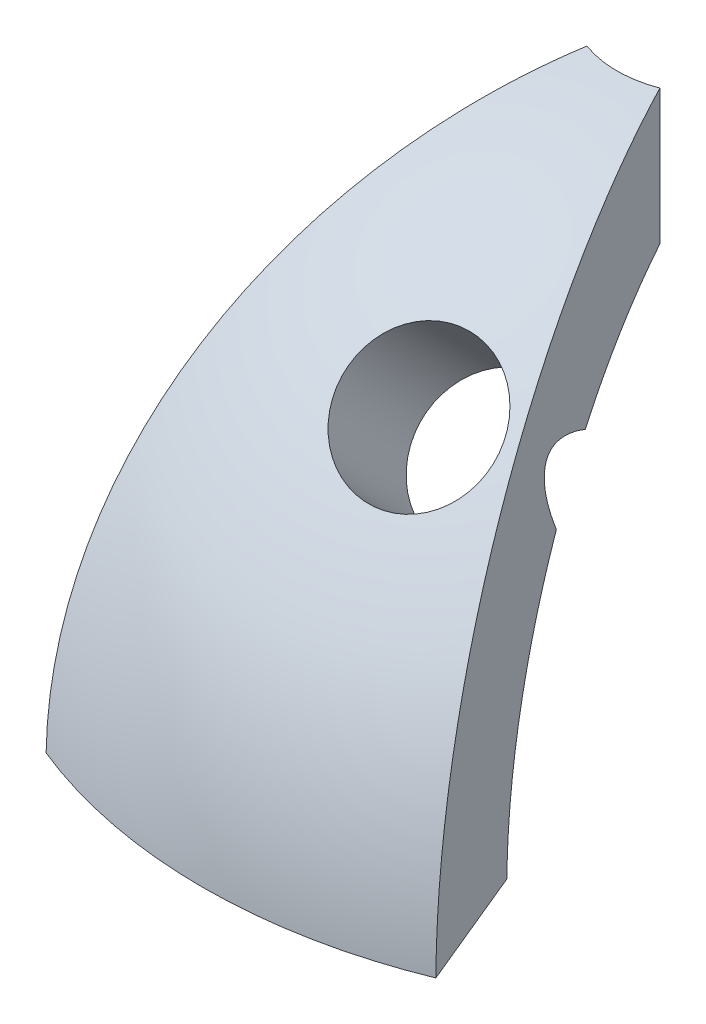
ISO-10303-21;
HEADER;
FILE_DESCRIPTION(('STEP AP214'),'2;1');
FILE_NAME('part.step','',(''),(''),'','','');
FILE_SCHEMA(('AUTOMOTIVE_DESIGN { 1 0 10303 214 1 1 1 1 }'));
ENDSEC;
DATA;
#1=APPLICATION_CONTEXT('core data for automotive mechanical design processes');
#2=APPLICATION_PROTOCOL_DEFINITION('international standard','automotive_design',2000,#1);
#3=PRODUCT_CONTEXT('',#1,'mechanical');
#4=PRODUCT('Part','Part','',(#3));
#5=PRODUCT_RELATED_PRODUCT_CATEGORY('part','',(#4));
#6=PRODUCT_DEFINITION_FORMATION('','',#4);
#7=PRODUCT_DEFINITION_CONTEXT('part definition',#1,'design');
#8=PRODUCT_DEFINITION('design','',#6,#7);
#9=PRODUCT_DEFINITION_SHAPE('','',#8);
#10=(LENGTH_UNIT() NAMED_UNIT(*) SI_UNIT(.MILLI.,.METRE.));
#11=(NAMED_UNIT(*) PLANE_ANGLE_UNIT() SI_UNIT($,.RADIAN.));
#12=(NAMED_UNIT(*) SI_UNIT($,.STERADIAN.) SOLID_ANGLE_UNIT());
#13=UNCERTAINTY_MEASURE_WITH_UNIT(LENGTH_MEASURE(1.E-05),#10,'distance_accuracy_value','');
#14=(GEOMETRIC_REPRESENTATION_CONTEXT(3) GLOBAL_UNCERTAINTY_ASSIGNED_CONTEXT((#13)) GLOBAL_UNIT_ASSIGNED_CONTEXT((#10,
#11,#12)) REPRESENTATION_CONTEXT('',''));
#15=CARTESIAN_POINT('',(0.,0.,0.));
#16=DIRECTION('',(0.,0.,1.));
#17=DIRECTION('',(1.,0.,0.));
#18=AXIS2_PLACEMENT_3D('',#15,#16,#17);
#19=CARTESIAN_POINT('',(0.,0.,0.));
#20=DIRECTION('',(0.,-1.,0.));
#21=DIRECTION('',(0.382683432365091,0.,0.923879532511287));
#22=AXIS2_PLACEMENT_3D('',#19,#20,#21);
#23=SPHERICAL_SURFACE('',#22,14.22);
#24=CARTESIAN_POINT('',(1.53865384615384,2.60126354312483,13.895120450033));
#25=CARTESIAN_POINT('',(1.43295666846133,2.7603553492787,13.8770437774443));
#26=CARTESIAN_POINT('',(1.32674036358629,2.91867206849215,13.8551917159716));
#27=CARTESIAN_POINT('',(1.11791548394628,3.22695924291126,13.8050421724665));
#28=CARTESIAN_POINT('',(1.0153409415016,3.37700264889497,13.7770511101305));
#29=CARTESIAN_POINT('',(0.814081481677308,3.66874815942652,13.7155710425161));
#30=CARTESIAN_POINT('',(0.715421543614758,3.81052911480833,13.6823742919679));
#31=CARTESIAN_POINT('',(0.522178746878185,4.0857824659932,13.6114028905999));
#32=CARTESIAN_POINT('',(0.427614532707512,4.21933947211681,13.5739051060821));
#33=CARTESIAN_POINT('',(0.226070652323176,4.5014823404095,13.4881351470725));
#34=CARTESIAN_POINT('',(0.119049274629687,4.64980674314402,13.4390984022335));
#35=CARTESIAN_POINT('',(-0.091588324743938,4.93890168078947,13.3356948987623));
#36=CARTESIAN_POINT('',(-0.195199182859857,5.07975923385487,13.281560191336));
#37=CARTESIAN_POINT('',(-0.398834780521729,5.35398172767666,13.1687292829852));
#38=CARTESIAN_POINT('',(-0.498859980621159,5.4874375467552,13.1102547423254));
#39=CARTESIAN_POINT('',(-0.695210440686985,5.74694021866717,12.9894883772696));
#40=CARTESIAN_POINT('',(-0.791540405244985,5.8730815436922,12.9274071277705));
#41=CARTESIAN_POINT('',(-0.88775340544872,5.99788098582003,12.8625704107326));
#42=B_SPLINE_CURVE_WITH_KNOTS('',3,(#24,#25,#26,#27,#28,#29,#30,#31,#32,#33,#34,#35,#36,#37,#38,
#39,#40,#41),.UNSPECIFIED.,.F.,.F.,(4,2,2,2,2,2,2,2,4),(0.,0.575527356792285,1.12707977508195,
1.65463075584792,2.15818884095048,2.72612225201319,3.2751312331309,3.80520900671717,
4.31637808545506),.UNSPECIFIED.);
#43=CARTESIAN_POINT('',(1.53865384615384,2.60126354312483,13.895120450033));
#44=VERTEX_POINT('',#43);
#45=CARTESIAN_POINT('',(-0.887753405448717,5.99788098582003,12.8625704107326));
#46=VERTEX_POINT('',#45);
#47=EDGE_CURVE('E239',#44,#46,#42,.T.);
#48=ORIENTED_EDGE('',*,*,#47,.T.);
#49=CARTESIAN_POINT('',(0.,0.571906271362396,-0.236891334004535));
#50=DIRECTION('',(0.,-0.923879532511287,0.38268343236509));
#51=DIRECTION('',(0.,-0.38268343236509,-0.923879532511287));
#52=AXIS2_PLACEMENT_3D('',#49,#50,#51);
#53=CIRCLE('',#52,14.2065198311427);
#54=CARTESIAN_POINT('',(-0.968782051282049,5.99585052480526,12.8576684442128));
#55=VERTEX_POINT('',#54);
#56=EDGE_CURVE('E241',#46,#55,#53,.T.);
#57=ORIENTED_EDGE('',*,*,#56,.T.);
#58=CARTESIAN_POINT('',(-0.968782051282052,0.,0.));
#59=DIRECTION('',(1.,0.,0.));
#60=DIRECTION('',(0.,0.,-1.));
#61=AXIS2_PLACEMENT_3D('',#58,#59,#60);
#62=CIRCLE('',#61,14.186960961993);
#63=CARTESIAN_POINT('',(-0.968782051282052,3.07583362103488,13.8495165573685));
#64=VERTEX_POINT('',#63);
#65=EDGE_CURVE('E303',#55,#64,#62,.T.);
#66=ORIENTED_EDGE('',*,*,#65,.T.);
#67=CARTESIAN_POINT('',(0.,-2.27115532080022,0.940743336131267));
#68=DIRECTION('',(0.,-0.923879532511287,0.38268343236509));
#69=DIRECTION('',(0.,-0.38268343236509,-0.923879532511287));
#70=AXIS2_PLACEMENT_3D('',#67,#68,#69);
#71=CIRCLE('',#70,14.0059007380577);
#72=CARTESIAN_POINT('',(-1.48166666666666,3.05859486275467,13.80789851333));
#73=VERTEX_POINT('',#72);
#74=EDGE_CURVE('E319',#64,#73,#71,.T.);
#75=ORIENTED_EDGE('',*,*,#74,.T.);
#76=CARTESIAN_POINT('',(-1.48166666666667,0.,0.));
#77=DIRECTION('',(1.,0.,0.));
#78=DIRECTION('',(0.,0.,-1.));
#79=AXIS2_PLACEMENT_3D('',#76,#77,#78);
#80=CIRCLE('',#79,14.1425974944099);
#81=CARTESIAN_POINT('',(-1.48166666666667,2.6036438321158,13.9008669759974));
#82=VERTEX_POINT('',#81);
#83=EDGE_CURVE('E551',#73,#82,#80,.T.);
#84=ORIENTED_EDGE('',*,*,#83,.T.);
#85=CARTESIAN_POINT('',(0.,-2.69234963075024,1.11520773170694));
#86=DIRECTION('',(0.,0.923879532511287,-0.38268343236509));
#87=DIRECTION('',(0.,0.38268343236509,0.923879532511287));
#88=AXIS2_PLACEMENT_3D('',#85,#86,#87);
#89=CIRCLE('',#88,13.9181882865889);
#90=CARTESIAN_POINT('',(-0.968782051282055,2.62099211279716,13.9427494305022));
#91=VERTEX_POINT('',#90);
#92=EDGE_CURVE('E556',#82,#91,#89,.T.);
#93=ORIENTED_EDGE('',*,*,#92,.T.);
#94=CARTESIAN_POINT('',(-0.968782051282052,0.,0.));
#95=DIRECTION('',(1.,0.,0.));
#96=DIRECTION('',(0.,0.,-1.));
#97=AXIS2_PLACEMENT_3D('',#94,#95,#96);
#98=CIRCLE('',#97,14.186960961993);
#99=CARTESIAN_POINT('',(-0.968782051282053,1.57551403444439,14.0992062494448));
#100=VERTEX_POINT('',#99);
#101=EDGE_CURVE('E561',#91,#100,#98,.T.);
#102=ORIENTED_EDGE('',*,*,#101,.T.);
#103=CARTESIAN_POINT('',(0.,-3.64003682813778,1.50775262175221));
#104=DIRECTION('',(0.,0.923879532511287,-0.38268343236509));
#105=DIRECTION('',(0.,0.38268343236509,0.923879532511287));
#106=AXIS2_PLACEMENT_3D('',#103,#104,#105);
#107=CIRCLE('',#106,13.6632797644416);
#108=CARTESIAN_POINT('',(-0.5698717948718,1.58412410957177,14.1199928095904));
#109=VERTEX_POINT('',#108);
#110=EDGE_CURVE('E566',#100,#109,#107,.T.);
#111=ORIENTED_EDGE('',*,*,#110,.T.);
#112=CARTESIAN_POINT('',(-0.569871794871796,0.,0.));
#113=DIRECTION('',(-1.,0.,0.));
#114=DIRECTION('',(0.,0.,1.));
#115=AXIS2_PLACEMENT_3D('',#112,#113,#114);
#116=CIRCLE('',#115,14.2085764993334);
#117=CARTESIAN_POINT('',(-0.569871794871799,2.62944397541602,13.9631540318639));
#118=VERTEX_POINT('',#117);
#119=EDGE_CURVE('E571',#109,#118,#116,.T.);
#120=ORIENTED_EDGE('',*,*,#119,.T.);
#121=CARTESIAN_POINT('',(0.,-2.69234963075024,1.11520773170694));
#122=DIRECTION('',(0.,0.923879532511287,-0.38268343236509));
#123=DIRECTION('',(0.,0.38268343236509,0.923879532511287));
#124=AXIS2_PLACEMENT_3D('',#121,#122,#123);
#125=CIRCLE('',#124,13.9181882865889);
#126=EDGE_CURVE('E243',#118,#44,#125,.T.);
#127=ORIENTED_EDGE('',*,*,#126,.T.);
#128=EDGE_LOOP('',(#48,#57,#66,#75,#84,#93,#102,#111,#120,#127));
#129=FACE_BOUND('',#128,.T.);
#130=CARTESIAN_POINT('',(-0.115484941563909,0.,0.0478354290456357));
#131=DIRECTION('',(0.923879532511287,0.,-0.382683432365091));
#132=DIRECTION('',(-0.38268343236509,0.,-0.923879532511286));
#133=AXIS2_PLACEMENT_3D('',#130,#131,#132);
#134=CIRCLE('',#133,14.2194505871359);
#135=CARTESIAN_POINT('',(3.2840355653589,11.1030815684665,8.25500394242411));
#136=VERTEX_POINT('',#135);
#137=CARTESIAN_POINT('',(1.34175402255179,13.7000839413487,3.56592149983228));
#138=VERTEX_POINT('',#137);
#139=EDGE_CURVE('E164',#136,#138,#134,.F.);
#140=ORIENTED_EDGE('',*,*,#139,.F.);
#141=CARTESIAN_POINT('',(1.54636947473554,9.88509453040284,9.76339261335967));
#142=DIRECTION('',(-0.110615871041227,-0.707106781186547,-0.698401123333712));
#143=DIRECTION('',(0.,0.70271351130156,-0.711472923612861));
#144=AXIS2_PLACEMENT_3D('',#141,#142,#143);
#145=CIRCLE('',#144,2.6035);
#146=CARTESIAN_POINT('',(4.03658696996794,9.19090485134972,10.0718237498142));
#147=VERTEX_POINT('',#146);
#148=EDGE_CURVE('E45',#136,#147,#145,.F.);
#149=ORIENTED_EDGE('',*,*,#148,.T.);
#150=CARTESIAN_POINT('',(5.32522212941495,0.249999999999996,13.182864228702));
#151=VERTEX_POINT('',#150);
#152=EDGE_CURVE('E161',#151,#147,#134,.F.);
#153=ORIENTED_EDGE('',*,*,#152,.F.);
#154=CARTESIAN_POINT('',(0.,0.249999999999996,0.));
#155=DIRECTION('',(0.,-1.,0.));
#156=DIRECTION('',(0.,0.,-1.));
#157=AXIS2_PLACEMENT_3D('',#154,#155,#156);
#158=CIRCLE('',#157,14.2178022211592);
#159=CARTESIAN_POINT('',(-5.32522212941495,0.249999999999996,13.182864228702));
#160=VERTEX_POINT('',#159);
#161=EDGE_CURVE('E169',#151,#160,#158,.T.);
#162=ORIENTED_EDGE('',*,*,#161,.T.);
#163=CARTESIAN_POINT('',(0.115484941563912,0.,0.0478354290456367));
#164=DIRECTION('',(-0.923879532511286,0.,-0.382683432365091));
#165=DIRECTION('',(-0.382683432365091,0.,0.923879532511286));
#166=AXIS2_PLACEMENT_3D('',#163,#164,#165);
#167=CIRCLE('',#166,14.2194505871359);
#168=CARTESIAN_POINT('',(-1.34175402255179,13.7000839413487,3.56592149983228));
#169=VERTEX_POINT('',#168);
#170=EDGE_CURVE('E355',#169,#160,#167,.F.);
#171=ORIENTED_EDGE('',*,*,#170,.F.);
#172=CARTESIAN_POINT('',(0.,13.7000839413487,0.));
#173=DIRECTION('',(0.,-1.,0.));
#174=DIRECTION('',(0.,0.,-1.));
#175=AXIS2_PLACEMENT_3D('',#172,#173,#174);
#176=CIRCLE('',#175,3.81);
#177=EDGE_CURVE('E182',#138,#169,#176,.T.);
#178=ORIENTED_EDGE('',*,*,#177,.F.);
#179=EDGE_LOOP('',(#140,#149,#153,#162,#171,#178));
#180=FACE_BOUND('',#179,.T.);
#181=ADVANCED_FACE('F32',(#129,#180),#23,.F.);
#182=CARTESIAN_POINT('',(0.,0.,0.));
#183=DIRECTION('',(0.,-1.,0.));
#184=DIRECTION('',(0.,0.,-1.));
#185=AXIS2_PLACEMENT_3D('',#182,#183,#184);
#186=CYLINDRICAL_SURFACE('',#185,3.81);
#187=DIRECTION('',(0.,-1.,0.));
#188=VECTOR('',#187,1.);
#189=CARTESIAN_POINT('',(1.34175402255179,0.249999999999994,3.56592149983228));
#190=LINE('',#189,#188);
#191=CARTESIAN_POINT('',(1.34175402255179,18.6651118400078,3.56592149983228));
#192=VERTEX_POINT('',#191);
#193=EDGE_CURVE('E332',#192,#138,#190,.T.);
#194=ORIENTED_EDGE('',*,*,#193,.T.);
#195=ORIENTED_EDGE('',*,*,#177,.T.);
#196=DIRECTION('',(0.,-1.,0.));
#197=VECTOR('',#196,1.);
#198=CARTESIAN_POINT('',(-1.34175402255179,0.249999999999994,3.56592149983228));
#199=LINE('',#198,#197);
#200=CARTESIAN_POINT('',(-1.34175402255179,18.6651118400078,3.56592149983228));
#201=VERTEX_POINT('',#200);
#202=EDGE_CURVE('E310',#201,#169,#199,.T.);
#203=ORIENTED_EDGE('',*,*,#202,.F.);
#204=CARTESIAN_POINT('',(0.,18.6651118400078,0.));
#205=DIRECTION('',(0.,-1.,0.));
#206=DIRECTION('',(0.,0.,-1.));
#207=AXIS2_PLACEMENT_3D('',#204,#205,#206);
#208=CIRCLE('',#207,3.81);
#209=EDGE_CURVE('E179',#192,#201,#208,.T.);
#210=ORIENTED_EDGE('',*,*,#209,.F.);
#211=EDGE_LOOP('',(#194,#195,#203,#210));
#212=FACE_BOUND('',#211,.T.);
#213=ADVANCED_FACE('F34',(#212),#186,.F.);
#214=CARTESIAN_POINT('',(0.,0.,0.));
#215=DIRECTION('',(0.,-1.,0.));
#216=DIRECTION('',(0.382683432365091,0.,0.923879532511287));
#217=AXIS2_PLACEMENT_3D('',#214,#215,#216);
#218=SPHERICAL_SURFACE('',#217,19.05);
#219=CARTESIAN_POINT('',(2.08746037533585,13.3439928010697,13.179706106602));
#220=DIRECTION('',(-0.110615871041227,-0.707106781186547,-0.698401123333712));
#221=DIRECTION('',(0.,0.70271351130156,-0.711472923612861));
#222=AXIS2_PLACEMENT_3D('',#219,#220,#221);
#223=CIRCLE('',#222,2.6035);
#224=CARTESIAN_POINT('',(2.08746037533585,15.1735074277433,11.3273863499759));
#225=VERTEX_POINT('',#224);
#226=EDGE_CURVE('E165',#225,#225,#223,.T.);
#227=ORIENTED_EDGE('',*,*,#226,.T.);
#228=EDGE_LOOP('',(#227));
#229=FACE_BOUND('',#228,.T.);
#230=CARTESIAN_POINT('',(-0.115484941563909,0.,0.0478354290456357));
#231=DIRECTION('',(0.923879532511287,0.,-0.382683432365091));
#232=DIRECTION('',(-0.38268343236509,0.,-0.923879532511286));
#233=AXIS2_PLACEMENT_3D('',#230,#231,#232);
#234=CIRCLE('',#233,19.0495898905987);
#235=CARTESIAN_POINT('',(7.17384970083417,0.249999999999994,17.6458459833991));
#236=VERTEX_POINT('',#235);
#237=EDGE_CURVE('E173',#192,#236,#234,.T.);
#238=ORIENTED_EDGE('',*,*,#237,.F.);
#239=ORIENTED_EDGE('',*,*,#209,.T.);
#240=CARTESIAN_POINT('',(0.115484941563912,0.,0.0478354290456367));
#241=DIRECTION('',(-0.923879532511286,0.,-0.382683432365091));
#242=DIRECTION('',(-0.382683432365091,0.,0.923879532511286));
#243=AXIS2_PLACEMENT_3D('',#240,#241,#242);
#244=CIRCLE('',#243,19.0495898905987);
#245=CARTESIAN_POINT('',(-7.17384970083417,0.249999999999995,17.6458459833991));
#246=VERTEX_POINT('',#245);
#247=EDGE_CURVE('E359',#246,#201,#244,.T.);
#248=ORIENTED_EDGE('',*,*,#247,.F.);
#249=CARTESIAN_POINT('',(0.,0.249999999999994,0.));
#250=DIRECTION('',(0.,-1.,0.));
#251=DIRECTION('',(0.,0.,-1.));
#252=AXIS2_PLACEMENT_3D('',#249,#250,#251);
#253=CIRCLE('',#252,19.0483595094171);
#254=EDGE_CURVE('E171',#236,#246,#253,.T.);
#255=ORIENTED_EDGE('',*,*,#254,.F.);
#256=EDGE_LOOP('',(#238,#239,#248,#255));
#257=FACE_BOUND('',#256,.T.);
#258=ADVANCED_FACE('F223',(#229,#257),#218,.T.);
#259=CARTESIAN_POINT('',(5.44091735468122,0.249999999999995,13.1355364694225));
#260=DIRECTION('',(0.,1.,0.));
#261=DIRECTION('',(0.,0.,1.));
#262=AXIS2_PLACEMENT_3D('',#259,#260,#261);
#263=PLANE('',#262);
#264=DIRECTION('',(-0.38268343236509,0.,-0.923879532511286));
#265=VECTOR('',#264,1.);
#266=CARTESIAN_POINT('',(5.32543241311731,0.249999999999995,13.1833718984682));
#267=LINE('',#266,#265);
#268=EDGE_CURVE('E40',#236,#151,#267,.T.);
#269=ORIENTED_EDGE('',*,*,#268,.F.);
#270=ORIENTED_EDGE('',*,*,#254,.T.);
#271=DIRECTION('',(-0.382683432365091,0.,0.923879532511286));
#272=VECTOR('',#271,1.);
#273=CARTESIAN_POINT('',(-3.73182461580675,0.249999999999995,9.33606234109748));
#274=LINE('',#273,#272);
#275=EDGE_CURVE('E185',#160,#246,#274,.T.);
#276=ORIENTED_EDGE('',*,*,#275,.F.);
#277=ORIENTED_EDGE('',*,*,#161,.F.);
#278=EDGE_LOOP('',(#269,#270,#276,#277));
#279=FACE_BOUND('',#278,.T.);
#280=ADVANCED_FACE('F213',(#279),#263,.F.);
#281=CARTESIAN_POINT('',(-7.17384970083417,0.249999999999994,17.6458459833991));
#282=DIRECTION('',(-0.923879532511286,0.,-0.382683432365091));
#283=DIRECTION('',(-0.382683432365091,0.,0.923879532511286));
#284=AXIS2_PLACEMENT_3D('',#281,#282,#283);
#285=PLANE('',#284);
#286=ORIENTED_EDGE('',*,*,#170,.T.);
#287=ORIENTED_EDGE('',*,*,#275,.T.);
#288=ORIENTED_EDGE('',*,*,#247,.T.);
#289=ORIENTED_EDGE('',*,*,#202,.T.);
#290=EDGE_LOOP('',(#286,#287,#288,#289));
#291=FACE_BOUND('',#290,.T.);
#292=ADVANCED_FACE('F211',(#291),#285,.T.);
#293=CARTESIAN_POINT('',(7.17384970083417,0.249999999999994,17.6458459833991));
#294=DIRECTION('',(0.923879532511287,0.,-0.382683432365091));
#295=DIRECTION('',(-0.38268343236509,0.,-0.923879532511286));
#296=AXIS2_PLACEMENT_3D('',#293,#294,#295);
#297=PLANE('',#296);
#298=CARTESIAN_POINT('',(0.0837639600420378,0.535457196216359,0.528864829590654));
#299=DIRECTION('',(0.923879532511287,0.,-0.382683432365091));
#300=DIRECTION('',(-0.266781183403519,-0.716941992237636,-0.644066751158719));
#301=AXIS2_PLACEMENT_3D('',#298,#299,#300);
#302=ELLIPSE('',#301,15.7720202655675,2.6035);
#303=EDGE_CURVE('E11',#136,#147,#302,.T.);
#304=ORIENTED_EDGE('',*,*,#303,.F.);
#305=ORIENTED_EDGE('',*,*,#139,.T.);
#306=ORIENTED_EDGE('',*,*,#193,.F.);
#307=ORIENTED_EDGE('',*,*,#237,.T.);
#308=ORIENTED_EDGE('',*,*,#268,.T.);
#309=ORIENTED_EDGE('',*,*,#152,.T.);
#310=EDGE_LOOP('',(#304,#305,#306,#307,#308,#309));
#311=FACE_BOUND('',#310,.T.);
#312=ADVANCED_FACE('F167',(#311),#297,.T.);
#313=CARTESIAN_POINT('',(0.,0.145802387731092,0.3519981018868));
#314=DIRECTION('',(0.,-1.,0.));
#315=DIRECTION('',(0.382683432365091,0.,0.923879532511287));
#316=AXIS2_PLACEMENT_3D('',#313,#314,#315);
#317=SPHERICAL_SURFACE('',#316,14.22);
#318=CARTESIAN_POINT('',(-0.968782051282052,0.145802387731092,0.3519981018868));
#319=DIRECTION('',(1.,0.,0.));
#320=DIRECTION('',(0.,0.,-1.));
#321=AXIS2_PLACEMENT_3D('',#318,#319,#320);
#322=CIRCLE('',#321,14.186960961993);
#323=CARTESIAN_POINT('',(-0.968782051282051,6.14165291253636,13.2096665460996));
#324=VERTEX_POINT('',#323);
#325=CARTESIAN_POINT('',(-0.968782051282052,3.22163600876598,14.2015146592553));
#326=VERTEX_POINT('',#325);
#327=EDGE_CURVE('E311',#324,#326,#322,.T.);
#328=ORIENTED_EDGE('',*,*,#327,.F.);
#329=CARTESIAN_POINT('',(0.,0.717708659093495,0.115106767882265));
#330=DIRECTION('',(0.,-0.923879532511287,0.38268343236509));
#331=DIRECTION('',(0.,-0.38268343236509,-0.923879532511287));
#332=AXIS2_PLACEMENT_3D('',#329,#330,#331);
#333=CIRCLE('',#332,14.2065198311427);
#334=CARTESIAN_POINT('',(-0.887753405448717,6.14368337355113,13.2145685126194));
#335=VERTEX_POINT('',#334);
#336=EDGE_CURVE('E272',#335,#324,#333,.T.);
#337=ORIENTED_EDGE('',*,*,#336,.F.);
#338=CARTESIAN_POINT('',(1.53865384615384,2.74706593085593,14.2471185519198));
#339=CARTESIAN_POINT('',(0.942856075964096,3.64389969782068,14.1451997195708));
#340=CARTESIAN_POINT('',(0.332896981673562,4.49773770684369,13.8855947627103));
#341=CARTESIAN_POINT('',(-0.27737066721651,5.35200763933077,13.6258584817918));
#342=CARTESIAN_POINT('',(-0.887753405448719,6.14368337355113,13.2145685126194));
#343=B_SPLINE_CURVE_WITH_KNOTS('',2,(#338,#339,#340,#341,#342),.UNSPECIFIED.,.F.,.F.,(3,2,3),
(0.,0.5,1.),.UNSPECIFIED.);
#344=CARTESIAN_POINT('',(1.53865384615384,2.74706593085593,14.2471185519198));
#345=VERTEX_POINT('',#344);
#346=EDGE_CURVE('E253',#345,#335,#343,.T.);
#347=ORIENTED_EDGE('',*,*,#346,.F.);
#348=CARTESIAN_POINT('',(0.,-2.54654724301914,1.46720583359374));
#349=DIRECTION('',(0.,0.923879532511287,-0.38268343236509));
#350=DIRECTION('',(0.,0.38268343236509,0.923879532511287));
#351=AXIS2_PLACEMENT_3D('',#348,#349,#350);
#352=CIRCLE('',#351,13.9181882865889);
#353=CARTESIAN_POINT('',(-0.569871794871799,2.77524636314712,14.3151521337507));
#354=VERTEX_POINT('',#353);
#355=EDGE_CURVE('E249',#354,#345,#352,.T.);
#356=ORIENTED_EDGE('',*,*,#355,.F.);
#357=CARTESIAN_POINT('',(-0.569871794871796,0.145802387731092,0.3519981018868));
#358=DIRECTION('',(-1.,0.,0.));
#359=DIRECTION('',(0.,0.,1.));
#360=AXIS2_PLACEMENT_3D('',#357,#358,#359);
#361=CIRCLE('',#360,14.2085764993334);
#362=CARTESIAN_POINT('',(-0.5698717948718,1.72992649730287,14.4719909114772));
#363=VERTEX_POINT('',#362);
#364=EDGE_CURVE('E266',#363,#354,#361,.T.);
#365=ORIENTED_EDGE('',*,*,#364,.F.);
#366=CARTESIAN_POINT('',(0.,-3.49423444040668,1.85975072363901));
#367=DIRECTION('',(0.,0.923879532511287,-0.38268343236509));
#368=DIRECTION('',(0.,0.38268343236509,0.923879532511287));
#369=AXIS2_PLACEMENT_3D('',#366,#367,#368);
#370=CIRCLE('',#369,13.6632797644416);
#371=CARTESIAN_POINT('',(-0.968782051282053,1.72131642217549,14.4512043513316));
#372=VERTEX_POINT('',#371);
#373=EDGE_CURVE('E573',#372,#363,#370,.T.);
#374=ORIENTED_EDGE('',*,*,#373,.F.);
#375=CARTESIAN_POINT('',(-0.968782051282052,0.145802387731092,0.3519981018868));
#376=DIRECTION('',(1.,0.,0.));
#377=DIRECTION('',(0.,0.,-1.));
#378=AXIS2_PLACEMENT_3D('',#375,#376,#377);
#379=CIRCLE('',#378,14.186960961993);
#380=CARTESIAN_POINT('',(-0.968782051282055,2.76679450052826,14.294747532389));
#381=VERTEX_POINT('',#380);
#382=EDGE_CURVE('E569',#381,#372,#379,.T.);
#383=ORIENTED_EDGE('',*,*,#382,.F.);
#384=CARTESIAN_POINT('',(0.,-2.54654724301914,1.46720583359374));
#385=DIRECTION('',(0.,0.923879532511287,-0.38268343236509));
#386=DIRECTION('',(0.,0.38268343236509,0.923879532511287));
#387=AXIS2_PLACEMENT_3D('',#384,#385,#386);
#388=CIRCLE('',#387,13.9181882865889);
#389=CARTESIAN_POINT('',(-1.48166666666667,2.7494462198469,14.2528650778842));
#390=VERTEX_POINT('',#389);
#391=EDGE_CURVE('E564',#390,#381,#388,.T.);
#392=ORIENTED_EDGE('',*,*,#391,.F.);
#393=CARTESIAN_POINT('',(-1.48166666666667,0.145802387731092,0.3519981018868));
#394=DIRECTION('',(1.,0.,0.));
#395=DIRECTION('',(0.,0.,-1.));
#396=AXIS2_PLACEMENT_3D('',#393,#394,#395);
#397=CIRCLE('',#396,14.1425974944099);
#398=CARTESIAN_POINT('',(-1.48166666666666,3.20439725048577,14.1598966152168));
#399=VERTEX_POINT('',#398);
#400=EDGE_CURVE('E559',#399,#390,#397,.T.);
#401=ORIENTED_EDGE('',*,*,#400,.F.);
#402=CARTESIAN_POINT('',(0.,-2.12535293306912,1.29274143801807));
#403=DIRECTION('',(0.,-0.923879532511287,0.38268343236509));
#404=DIRECTION('',(0.,-0.38268343236509,-0.923879532511287));
#405=AXIS2_PLACEMENT_3D('',#402,#403,#404);
#406=CIRCLE('',#405,14.0059007380577);
#407=EDGE_CURVE('E554',#326,#399,#406,.T.);
#408=ORIENTED_EDGE('',*,*,#407,.F.);
#409=EDGE_LOOP('',(#328,#337,#347,#356,#365,#374,#383,#392,#401,#408));
#410=FACE_BOUND('',#409,.T.);
#411=CARTESIAN_POINT('',(-0.569871794871796,5.09177524263906,13.671945498777));
#412=CARTESIAN_POINT('',(0.0976163205015163,4.189697782468,14.0354629464904));
#413=CARTESIAN_POINT('',(0.755080128205128,3.22667851307499,14.2136883415465));
#414=B_SPLINE_CURVE_WITH_KNOTS('',2,(#411,#412,#413),.UNSPECIFIED.,.F.,.F.,(3,3),(0.,1.),.UNSPECIFIED.);
#415=CARTESIAN_POINT('',(-0.569871794871796,5.09177524263906,13.671945498777));
#416=VERTEX_POINT('',#415);
#417=CARTESIAN_POINT('',(0.755080128205129,3.22667851307498,14.2136883415465));
#418=VERTEX_POINT('',#417);
#419=EDGE_CURVE('E327',#416,#418,#414,.T.);
#420=ORIENTED_EDGE('',*,*,#419,.F.);
#421=CARTESIAN_POINT('',(-0.569871794871796,0.145802387731092,0.3519981018868));
#422=DIRECTION('',(-1.,0.,0.));
#423=DIRECTION('',(0.,0.,1.));
#424=AXIS2_PLACEMENT_3D('',#421,#422,#423);
#425=CIRCLE('',#424,14.2085764993334);
#426=CARTESIAN_POINT('',(-0.569871794871795,3.23003476970419,14.2217910618195));
#427=VERTEX_POINT('',#426);
#428=EDGE_CURVE('E604',#427,#416,#425,.T.);
#429=ORIENTED_EDGE('',*,*,#428,.F.);
#430=CARTESIAN_POINT('',(0.,-2.12535293306912,1.29274143801807));
#431=DIRECTION('',(0.,-0.923879532511287,0.38268343236509));
#432=DIRECTION('',(0.,-0.38268343236509,-0.923879532511287));
#433=AXIS2_PLACEMENT_3D('',#430,#431,#432);
#434=CIRCLE('',#433,14.0059007380577);
#435=EDGE_CURVE('E619',#418,#427,#434,.T.);
#436=ORIENTED_EDGE('',*,*,#435,.F.);
#437=EDGE_LOOP('',(#420,#429,#436));
#438=FACE_BOUND('',#437,.T.);
#439=ADVANCED_FACE('F334',(#410,#438),#317,.F.);
#440=CARTESIAN_POINT('',(-0.968782051282052,5.99585052480526,12.8576684442128));
#441=DIRECTION('',(0.,0.923879532511287,-0.38268343236509));
#442=DIRECTION('',(0.,0.38268343236509,0.923879532511287));
#443=AXIS2_PLACEMENT_3D('',#440,#441,#442);
#444=PLANE('',#443);
#445=ORIENTED_EDGE('',*,*,#336,.T.);
#446=DIRECTION('',(0.,0.38268343236509,0.923879532511287));
#447=VECTOR('',#446,1.);
#448=CARTESIAN_POINT('',(-0.968782051282052,5.99585052480526,12.8576684442128));
#449=LINE('',#448,#447);
#450=EDGE_CURVE('E256',#55,#324,#449,.T.);
#451=ORIENTED_EDGE('',*,*,#450,.F.);
#452=ORIENTED_EDGE('',*,*,#56,.F.);
#453=DIRECTION('',(0.,0.38268343236509,0.923879532511287));
#454=VECTOR('',#453,1.);
#455=CARTESIAN_POINT('',(-0.887753405448719,5.99788098582003,12.8625704107326));
#456=LINE('',#455,#454);
#457=EDGE_CURVE('E269',#46,#335,#456,.T.);
#458=ORIENTED_EDGE('',*,*,#457,.T.);
#459=EDGE_LOOP('',(#445,#451,#452,#458));
#460=FACE_BOUND('',#459,.T.);
#461=ADVANCED_FACE('F293',(#460),#444,.F.);
#462=CARTESIAN_POINT('',(-0.887753405448719,5.99788098582003,12.8625704107326));
#463=DIRECTION('',(0.824332768950697,0.523013324597389,-0.21663921235008));
#464=DIRECTION('',(-0.535736127693909,0.844385457882557,0.));
#465=AXIS2_PLACEMENT_3D('',#462,#463,#464);
#466=PLANE('',#465);
#467=ORIENTED_EDGE('',*,*,#346,.T.);
#468=ORIENTED_EDGE('',*,*,#457,.F.);
#469=ORIENTED_EDGE('',*,*,#47,.F.);
#470=DIRECTION('',(0.,0.38268343236509,0.923879532511287));
#471=VECTOR('',#470,1.);
#472=CARTESIAN_POINT('',(1.53865384615384,2.60126354312483,13.895120450033));
#473=LINE('',#472,#471);
#474=EDGE_CURVE('E250',#44,#345,#473,.T.);
#475=ORIENTED_EDGE('',*,*,#474,.T.);
#476=EDGE_LOOP('',(#467,#468,#469,#475));
#477=FACE_BOUND('',#476,.T.);
#478=ADVANCED_FACE('F282',(#477),#466,.F.);
#479=CARTESIAN_POINT('',(1.53865384615384,2.60126354312483,13.895120450033));
#480=DIRECTION('',(0.,-0.923879532511287,0.38268343236509));
#481=DIRECTION('',(0.,-0.38268343236509,-0.923879532511287));
#482=AXIS2_PLACEMENT_3D('',#479,#480,#481);
#483=PLANE('',#482);
#484=ORIENTED_EDGE('',*,*,#355,.T.);
#485=ORIENTED_EDGE('',*,*,#474,.F.);
#486=ORIENTED_EDGE('',*,*,#126,.F.);
#487=DIRECTION('',(0.,0.38268343236509,0.923879532511287));
#488=VECTOR('',#487,1.);
#489=CARTESIAN_POINT('',(-0.569871794871796,2.62944397541602,13.9631540318639));
#490=LINE('',#489,#488);
#491=EDGE_CURVE('E251',#118,#354,#490,.T.);
#492=ORIENTED_EDGE('',*,*,#491,.T.);
#493=EDGE_LOOP('',(#484,#485,#486,#492));
#494=FACE_BOUND('',#493,.T.);
#495=ADVANCED_FACE('F292',(#494),#483,.F.);
#496=CARTESIAN_POINT('',(-0.569871794871796,2.62944397541602,13.9631540318639));
#497=DIRECTION('',(1.,0.,0.));
#498=DIRECTION('',(0.,1.,0.));
#499=AXIS2_PLACEMENT_3D('',#496,#497,#498);
#500=PLANE('',#499);
#501=ORIENTED_EDGE('',*,*,#364,.T.);
#502=ORIENTED_EDGE('',*,*,#491,.F.);
#503=ORIENTED_EDGE('',*,*,#119,.F.);
#504=DIRECTION('',(0.,0.38268343236509,0.923879532511287));
#505=VECTOR('',#504,1.);
#506=CARTESIAN_POINT('',(-0.569871794871803,1.58412410957177,14.1199928095904));
#507=LINE('',#506,#505);
#508=EDGE_CURVE('E574',#109,#363,#507,.T.);
#509=ORIENTED_EDGE('',*,*,#508,.T.);
#510=EDGE_LOOP('',(#501,#502,#503,#509));
#511=FACE_BOUND('',#510,.T.);
#512=ADVANCED_FACE('F422',(#511),#500,.F.);
#513=CARTESIAN_POINT('',(-0.569871794871803,1.58412410957177,14.1199928095904));
#514=DIRECTION('',(0.,-0.923879532511287,0.38268343236509));
#515=DIRECTION('',(0.,-0.38268343236509,-0.923879532511287));
#516=AXIS2_PLACEMENT_3D('',#513,#514,#515);
#517=PLANE('',#516);
#518=ORIENTED_EDGE('',*,*,#373,.T.);
#519=ORIENTED_EDGE('',*,*,#508,.F.);
#520=ORIENTED_EDGE('',*,*,#110,.F.);
#521=DIRECTION('',(0.,0.38268343236509,0.923879532511287));
#522=VECTOR('',#521,1.);
#523=CARTESIAN_POINT('',(-0.968782051282052,1.57551403444439,14.0992062494448));
#524=LINE('',#523,#522);
#525=EDGE_CURVE('E570',#100,#372,#524,.T.);
#526=ORIENTED_EDGE('',*,*,#525,.T.);
#527=EDGE_LOOP('',(#518,#519,#520,#526));
#528=FACE_BOUND('',#527,.T.);
#529=ADVANCED_FACE('F430',(#528),#517,.F.);
#530=CARTESIAN_POINT('',(-0.968782051282052,1.57551403444439,14.0992062494448));
#531=DIRECTION('',(-1.,0.,0.));
#532=DIRECTION('',(0.,-1.,0.));
#533=AXIS2_PLACEMENT_3D('',#530,#531,#532);
#534=PLANE('',#533);
#535=ORIENTED_EDGE('',*,*,#382,.T.);
#536=ORIENTED_EDGE('',*,*,#525,.F.);
#537=ORIENTED_EDGE('',*,*,#101,.F.);
#538=DIRECTION('',(0.,0.38268343236509,0.923879532511287));
#539=VECTOR('',#538,1.);
#540=CARTESIAN_POINT('',(-0.968782051282058,2.62099211279716,13.9427494305022));
#541=LINE('',#540,#539);
#542=EDGE_CURVE('E565',#91,#381,#541,.T.);
#543=ORIENTED_EDGE('',*,*,#542,.T.);
#544=EDGE_LOOP('',(#535,#536,#537,#543));
#545=FACE_BOUND('',#544,.T.);
#546=ADVANCED_FACE('F438',(#545),#534,.F.);
#547=CARTESIAN_POINT('',(-0.968782051282058,2.62099211279716,13.9427494305022));
#548=DIRECTION('',(0.,-0.923879532511287,0.38268343236509));
#549=DIRECTION('',(0.,-0.38268343236509,-0.923879532511287));
#550=AXIS2_PLACEMENT_3D('',#547,#548,#549);
#551=PLANE('',#550);
#552=ORIENTED_EDGE('',*,*,#391,.T.);
#553=ORIENTED_EDGE('',*,*,#542,.F.);
#554=ORIENTED_EDGE('',*,*,#92,.F.);
#555=DIRECTION('',(0.,0.38268343236509,0.923879532511287));
#556=VECTOR('',#555,1.);
#557=CARTESIAN_POINT('',(-1.48166666666667,2.6036438321158,13.9008669759974));
#558=LINE('',#557,#556);
#559=EDGE_CURVE('E560',#82,#390,#558,.T.);
#560=ORIENTED_EDGE('',*,*,#559,.T.);
#561=EDGE_LOOP('',(#552,#553,#554,#560));
#562=FACE_BOUND('',#561,.T.);
#563=ADVANCED_FACE('F447',(#562),#551,.F.);
#564=CARTESIAN_POINT('',(-1.48166666666667,2.6036438321158,13.9008669759974));
#565=DIRECTION('',(-1.,0.,0.));
#566=DIRECTION('',(0.,-1.,0.));
#567=AXIS2_PLACEMENT_3D('',#564,#565,#566);
#568=PLANE('',#567);
#569=ORIENTED_EDGE('',*,*,#400,.T.);
#570=ORIENTED_EDGE('',*,*,#559,.F.);
#571=ORIENTED_EDGE('',*,*,#83,.F.);
#572=DIRECTION('',(0.,0.38268343236509,0.923879532511287));
#573=VECTOR('',#572,1.);
#574=CARTESIAN_POINT('',(-1.48166666666665,3.05859486275467,13.80789851333));
#575=LINE('',#574,#573);
#576=EDGE_CURVE('E555',#73,#399,#575,.T.);
#577=ORIENTED_EDGE('',*,*,#576,.T.);
#578=EDGE_LOOP('',(#569,#570,#571,#577));
#579=FACE_BOUND('',#578,.T.);
#580=ADVANCED_FACE('F456',(#579),#568,.F.);
#581=CARTESIAN_POINT('',(-1.48166666666665,3.05859486275467,13.80789851333));
#582=DIRECTION('',(0.,0.923879532511287,-0.38268343236509));
#583=DIRECTION('',(0.,0.38268343236509,0.923879532511287));
#584=AXIS2_PLACEMENT_3D('',#581,#582,#583);
#585=PLANE('',#584);
#586=ORIENTED_EDGE('',*,*,#407,.T.);
#587=ORIENTED_EDGE('',*,*,#576,.F.);
#588=ORIENTED_EDGE('',*,*,#74,.F.);
#589=DIRECTION('',(0.,0.38268343236509,0.923879532511287));
#590=VECTOR('',#589,1.);
#591=CARTESIAN_POINT('',(-0.968782051282052,3.07583362103488,13.8495165573685));
#592=LINE('',#591,#590);
#593=EDGE_CURVE('E53',#64,#326,#592,.T.);
#594=ORIENTED_EDGE('',*,*,#593,.T.);
#595=EDGE_LOOP('',(#586,#587,#588,#594));
#596=FACE_BOUND('',#595,.T.);
#597=ADVANCED_FACE('F465',(#596),#585,.F.);
#598=CARTESIAN_POINT('',(-0.968782051282052,3.07583362103488,13.8495165573685));
#599=DIRECTION('',(-1.,0.,0.));
#600=DIRECTION('',(0.,0.,1.));
#601=AXIS2_PLACEMENT_3D('',#598,#599,#600);
#602=PLANE('',#601);
#603=ORIENTED_EDGE('',*,*,#327,.T.);
#604=ORIENTED_EDGE('',*,*,#593,.F.);
#605=ORIENTED_EDGE('',*,*,#65,.F.);
#606=ORIENTED_EDGE('',*,*,#450,.T.);
#607=EDGE_LOOP('',(#603,#604,#605,#606));
#608=FACE_BOUND('',#607,.T.);
#609=ADVANCED_FACE('F344',(#608),#602,.F.);
#610=CARTESIAN_POINT('',(-0.569871794871796,3.08423238197309,13.8697929599327));
#611=DIRECTION('',(0.,0.923879532511287,-0.38268343236509));
#612=DIRECTION('',(0.,0.38268343236509,0.923879532511287));
#613=AXIS2_PLACEMENT_3D('',#610,#611,#612);
#614=PLANE('',#613);
#615=ORIENTED_EDGE('',*,*,#435,.T.);
#616=DIRECTION('',(0.,0.38268343236509,0.923879532511287));
#617=VECTOR('',#616,1.);
#618=CARTESIAN_POINT('',(-0.569871794871796,3.08423238197309,13.8697929599327));
#619=LINE('',#618,#617);
#620=CARTESIAN_POINT('',(-0.569871794871796,3.08423238197309,13.8697929599327));
#621=VERTEX_POINT('',#620);
#622=EDGE_CURVE('E539',#621,#427,#619,.T.);
#623=ORIENTED_EDGE('',*,*,#622,.F.);
#624=CARTESIAN_POINT('',(0.,-2.27115532080022,0.940743336131267));
#625=DIRECTION('',(0.,-0.923879532511287,0.38268343236509));
#626=DIRECTION('',(0.,-0.38268343236509,-0.923879532511287));
#627=AXIS2_PLACEMENT_3D('',#624,#625,#626);
#628=CIRCLE('',#627,14.0059007380577);
#629=CARTESIAN_POINT('',(0.755080128205129,3.08087612534389,13.8616902396597));
#630=VERTEX_POINT('',#629);
#631=EDGE_CURVE('E546',#630,#621,#628,.T.);
#632=ORIENTED_EDGE('',*,*,#631,.F.);
#633=DIRECTION('',(0.,0.38268343236509,0.923879532511287));
#634=VECTOR('',#633,1.);
#635=CARTESIAN_POINT('',(0.755080128205128,3.08087612534389,13.8616902396597));
#636=LINE('',#635,#634);
#637=EDGE_CURVE('E617',#630,#418,#636,.T.);
#638=ORIENTED_EDGE('',*,*,#637,.T.);
#639=EDGE_LOOP('',(#615,#623,#632,#638));
#640=FACE_BOUND('',#639,.T.);
#641=ADVANCED_FACE('F210',(#640),#614,.F.);
#642=CARTESIAN_POINT('',(0.755080128205128,3.08087612534389,13.8616902396597));
#643=DIRECTION('',(-0.824485520133181,-0.522807768354066,0.216554068166266));
#644=DIRECTION('',(0.535515208927868,-0.84452558339398,0.));
#645=AXIS2_PLACEMENT_3D('',#642,#643,#644);
#646=PLANE('',#645);
#647=ORIENTED_EDGE('',*,*,#419,.T.);
#648=ORIENTED_EDGE('',*,*,#637,.F.);
#649=CARTESIAN_POINT('',(-0.569871794871795,4.94597285490796,13.3199473968903));
#650=CARTESIAN_POINT('',(-0.518342475155737,4.87633248281951,13.3480110348248));
#651=CARTESIAN_POINT('',(-0.466822490784482,4.80635851391962,13.3752640402991));
#652=CARTESIAN_POINT('',(-0.362681801580785,4.66422839616778,13.428719062482));
#653=CARTESIAN_POINT('',(-0.310061796055294,4.59205809099275,13.4548848065902));
#654=CARTESIAN_POINT('',(-0.203736075710819,4.44552403179473,13.5060447980249));
#655=CARTESIAN_POINT('',(-0.150031373156345,4.37114650365505,13.5310017018053));
#656=CARTESIAN_POINT('',(-0.0415573937420347,4.2201885122786,13.5796209469265));
#657=CARTESIAN_POINT('',(0.0132104590640552,4.14359466260021,13.6032449074834));
#658=CARTESIAN_POINT('',(0.123784205182535,3.98819711564959,13.6490724059564));
#659=CARTESIAN_POINT('',(0.179588187515117,3.9093804403458,13.6712365534907));
#660=CARTESIAN_POINT('',(0.292201659547467,3.74953292315001,13.7140161283055));
#661=CARTESIAN_POINT('',(0.349008670965445,3.66848953042663,13.7345911898816));
#662=CARTESIAN_POINT('',(0.463589635718173,3.50418719327627,13.7740619323127));
#663=CARTESIAN_POINT('',(0.521360469885532,3.42091614852662,13.7929163068584));
#664=CARTESIAN_POINT('',(0.637823538224613,3.25215992741247,13.8288134030971));
#665=CARTESIAN_POINT('',(0.696511927478725,3.16666311942506,13.8458139261688));
#666=CARTESIAN_POINT('',(0.755080128205129,3.08087612534388,13.8616902396597));
#667=B_SPLINE_CURVE_WITH_KNOTS('',3,(#649,#650,#651,#652,#653,#654,#655,#656,#657,#658,#659,
#660,#661,#662,#663,#664,#665,#666),.UNSPECIFIED.,.F.,.F.,(4,2,2,2,2,2,2,2,4),(0.,
0.273187325478248,0.552379962400823,0.837582684731248,1.12879765037593,1.4260243655904,
1.7292596439772,2.03849756125805,2.35372940698862),.UNSPECIFIED.);
#668=CARTESIAN_POINT('',(-0.569871794871796,4.94597285490796,13.3199473968902));
#669=VERTEX_POINT('',#668);
#670=EDGE_CURVE('E193',#669,#630,#667,.T.);
#671=ORIENTED_EDGE('',*,*,#670,.F.);
#672=DIRECTION('',(0.,0.38268343236509,0.923879532511287));
#673=VECTOR('',#672,1.);
#674=CARTESIAN_POINT('',(-0.569871794871796,4.94597285490796,13.3199473968902));
#675=LINE('',#674,#673);
#676=EDGE_CURVE('E625',#669,#416,#675,.T.);
#677=ORIENTED_EDGE('',*,*,#676,.T.);
#678=EDGE_LOOP('',(#647,#648,#671,#677));
#679=FACE_BOUND('',#678,.T.);
#680=ADVANCED_FACE('F487',(#679),#646,.F.);
#681=CARTESIAN_POINT('',(-0.569871794871796,4.94597285490796,13.3199473968902));
#682=DIRECTION('',(1.,0.,0.));
#683=DIRECTION('',(0.,0.,-1.));
#684=AXIS2_PLACEMENT_3D('',#681,#682,#683);
#685=PLANE('',#684);
#686=ORIENTED_EDGE('',*,*,#428,.T.);
#687=ORIENTED_EDGE('',*,*,#676,.F.);
#688=CARTESIAN_POINT('',(-0.569871794871796,0.,0.));
#689=DIRECTION('',(-1.,0.,0.));
#690=DIRECTION('',(0.,0.,1.));
#691=AXIS2_PLACEMENT_3D('',#688,#689,#690);
#692=CIRCLE('',#691,14.2085764993334);
#693=EDGE_CURVE('E602',#621,#669,#692,.T.);
#694=ORIENTED_EDGE('',*,*,#693,.F.);
#695=ORIENTED_EDGE('',*,*,#622,.T.);
#696=EDGE_LOOP('',(#686,#687,#694,#695));
#697=FACE_BOUND('',#696,.T.);
#698=ADVANCED_FACE('F209',(#697),#685,.F.);
#699=ORIENTED_EDGE('',*,*,#670,.T.);
#700=ORIENTED_EDGE('',*,*,#631,.T.);
#701=ORIENTED_EDGE('',*,*,#693,.T.);
#702=EDGE_LOOP('',(#699,#700,#701));
#703=FACE_BOUND('',#702,.T.);
#704=ADVANCED_FACE('F199',(#703),#23,.F.);
#705=CARTESIAN_POINT('',(3.01927839263041,19.3005958875763,19.0629735246976));
#706=DIRECTION('',(-0.110615871041227,-0.707106781186547,-0.698401123333712));
#707=DIRECTION('',(0.,0.70271351130156,-0.711472923612861));
#708=AXIS2_PLACEMENT_3D('',#705,#706,#707);
#709=CYLINDRICAL_SURFACE('',#708,2.6035);
#710=ORIENTED_EDGE('',*,*,#303,.T.);
#711=ORIENTED_EDGE('',*,*,#148,.F.);
#712=EDGE_LOOP('',(#710,#711));
#713=FACE_BOUND('',#712,.T.);
#714=ORIENTED_EDGE('',*,*,#226,.F.);
#715=EDGE_LOOP('',(#714));
#716=FACE_BOUND('',#715,.T.);
#717=ADVANCED_FACE('F153',(#713,#716),#709,.F.);
#718=CLOSED_SHELL('',(#181,#213,#258,#280,#292,#312,#439,#461,#478,#495,#512,#529,#546,#563,
#580,#597,#609,#641,#680,#698,#704,#717));
#719=MANIFOLD_SOLID_BREP('B2',#718);
#720=ADVANCED_BREP_SHAPE_REPRESENTATION('',(#18,#719),#14);
#721=SHAPE_DEFINITION_REPRESENTATION(#9,#720);
ENDSEC;
END-ISO-10303-21;
